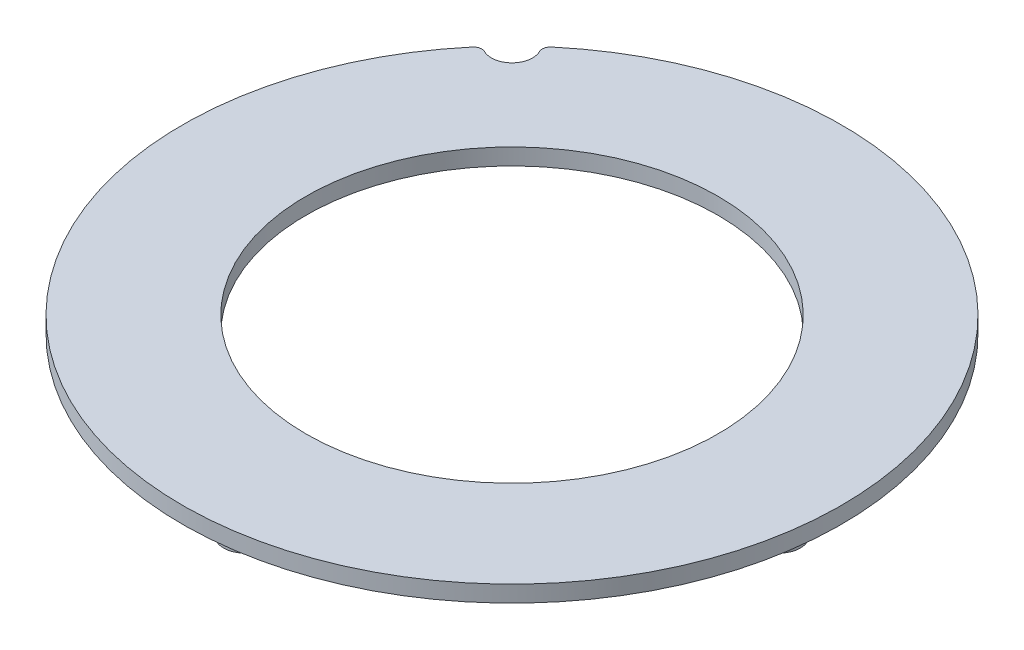
ISO-10303-21;
HEADER;
FILE_DESCRIPTION(('STEP AP214'),'2;1');
FILE_NAME('part.step','',(''),(''),'','','');
FILE_SCHEMA(('AUTOMOTIVE_DESIGN { 1 0 10303 214 1 1 1 1 }'));
ENDSEC;
DATA;
#1=APPLICATION_CONTEXT('core data for automotive mechanical design processes');
#2=APPLICATION_PROTOCOL_DEFINITION('international standard','automotive_design',2000,#1);
#3=PRODUCT_CONTEXT('',#1,'mechanical');
#4=PRODUCT('Part','Part','',(#3));
#5=PRODUCT_RELATED_PRODUCT_CATEGORY('part','',(#4));
#6=PRODUCT_DEFINITION_FORMATION('','',#4);
#7=PRODUCT_DEFINITION_CONTEXT('part definition',#1,'design');
#8=PRODUCT_DEFINITION('design','',#6,#7);
#9=PRODUCT_DEFINITION_SHAPE('','',#8);
#10=(LENGTH_UNIT() NAMED_UNIT(*) SI_UNIT(.MILLI.,.METRE.));
#11=(NAMED_UNIT(*) PLANE_ANGLE_UNIT() SI_UNIT($,.RADIAN.));
#12=(NAMED_UNIT(*) SI_UNIT($,.STERADIAN.) SOLID_ANGLE_UNIT());
#13=UNCERTAINTY_MEASURE_WITH_UNIT(LENGTH_MEASURE(1.E-05),#10,'distance_accuracy_value','');
#14=(GEOMETRIC_REPRESENTATION_CONTEXT(3) GLOBAL_UNCERTAINTY_ASSIGNED_CONTEXT((#13)) GLOBAL_UNIT_ASSIGNED_CONTEXT((#10,
#11,#12)) REPRESENTATION_CONTEXT('',''));
#15=CARTESIAN_POINT('',(0.,0.,0.));
#16=DIRECTION('',(0.,0.,1.));
#17=DIRECTION('',(1.,0.,0.));
#18=AXIS2_PLACEMENT_3D('',#15,#16,#17);
#19=CARTESIAN_POINT('',(-29.8174898076826,-8.,-25.1379653426594));
#20=DIRECTION('',(0.,1.,0.));
#21=DIRECTION('',(0.,0.,1.));
#22=AXIS2_PLACEMENT_3D('',#19,#20,#21);
#23=CYLINDRICAL_SURFACE('',#22,1.);
#24=DIRECTION('',(0.,-1.,0.));
#25=VECTOR('',#24,1.);
#26=CARTESIAN_POINT('',(-30.5820408283924,2.,-25.7825285565737));
#27=LINE('',#26,#25);
#28=CARTESIAN_POINT('',(-30.5820408283924,2.,-25.7825285565737));
#29=VERTEX_POINT('',#28);
#30=CARTESIAN_POINT('',(-30.5820408283924,0.,-25.7825285565737));
#31=VERTEX_POINT('',#30);
#32=EDGE_CURVE('E98',#29,#31,#27,.T.);
#33=ORIENTED_EDGE('',*,*,#32,.F.);
#34=CARTESIAN_POINT('',(-29.8174898076826,2.,-25.1379653426594));
#35=DIRECTION('',(0.,1.,0.));
#36=DIRECTION('',(0.,0.,1.));
#37=AXIS2_PLACEMENT_3D('',#34,#35,#36);
#38=CIRCLE('',#37,1.);
#39=CARTESIAN_POINT('',(-29.3794273619053,2.,-26.0369098868887));
#40=VERTEX_POINT('',#39);
#41=EDGE_CURVE('E51',#40,#29,#38,.T.);
#42=ORIENTED_EDGE('',*,*,#41,.F.);
#43=DIRECTION('',(0.,1.,0.));
#44=VECTOR('',#43,1.);
#45=CARTESIAN_POINT('',(-29.3794273619053,-8.,-26.0369098868887));
#46=LINE('',#45,#44);
#47=CARTESIAN_POINT('',(-29.3794273619053,0.,-26.0369098868887));
#48=VERTEX_POINT('',#47);
#49=EDGE_CURVE('E115',#48,#40,#46,.T.);
#50=ORIENTED_EDGE('',*,*,#49,.F.);
#51=CARTESIAN_POINT('',(-29.8174898076826,0.,-25.1379653426594));
#52=DIRECTION('',(0.,1.,0.));
#53=DIRECTION('',(0.,0.,1.));
#54=AXIS2_PLACEMENT_3D('',#51,#52,#53);
#55=CIRCLE('',#54,1.);
#56=EDGE_CURVE('E13',#31,#48,#55,.F.);
#57=ORIENTED_EDGE('',*,*,#56,.F.);
#58=EDGE_LOOP('',(#33,#42,#50,#57));
#59=FACE_BOUND('',#58,.T.);
#60=ADVANCED_FACE('F44',(#59),#23,.T.);
#61=CARTESIAN_POINT('',(-25.1379653426595,2.,-29.8174898076825));
#62=DIRECTION('',(0.,1.,0.));
#63=DIRECTION('',(0.,0.,1.));
#64=AXIS2_PLACEMENT_3D('',#61,#62,#63);
#65=CYLINDRICAL_SURFACE('',#64,1.);
#66=DIRECTION('',(0.,1.,0.));
#67=VECTOR('',#66,1.);
#68=CARTESIAN_POINT('',(-26.0369098868888,-8.,-29.3794273619052));
#69=LINE('',#68,#67);
#70=CARTESIAN_POINT('',(-26.0369098868888,2.,-29.3794273619052));
#71=VERTEX_POINT('',#70);
#72=CARTESIAN_POINT('',(-26.0369098868888,0.,-29.3794273619052));
#73=VERTEX_POINT('',#72);
#74=EDGE_CURVE('E95',#71,#73,#69,.F.);
#75=ORIENTED_EDGE('',*,*,#74,.F.);
#76=CARTESIAN_POINT('',(-25.1379653426595,2.,-29.8174898076825));
#77=DIRECTION('',(0.,1.,0.));
#78=DIRECTION('',(0.,0.,1.));
#79=AXIS2_PLACEMENT_3D('',#76,#77,#78);
#80=CIRCLE('',#79,1.);
#81=CARTESIAN_POINT('',(-25.7825285565738,2.,-30.5820408283923));
#82=VERTEX_POINT('',#81);
#83=EDGE_CURVE('E99',#82,#71,#80,.T.);
#84=ORIENTED_EDGE('',*,*,#83,.F.);
#85=DIRECTION('',(0.,-1.,0.));
#86=VECTOR('',#85,1.);
#87=CARTESIAN_POINT('',(-25.7825285565738,2.,-30.5820408283923));
#88=LINE('',#87,#86);
#89=CARTESIAN_POINT('',(-25.7825285565738,0.,-30.5820408283923));
#90=VERTEX_POINT('',#89);
#91=EDGE_CURVE('E97',#90,#82,#88,.F.);
#92=ORIENTED_EDGE('',*,*,#91,.F.);
#93=CARTESIAN_POINT('',(-25.1379653426595,0.,-29.8174898076825));
#94=DIRECTION('',(0.,1.,0.));
#95=DIRECTION('',(0.,0.,1.));
#96=AXIS2_PLACEMENT_3D('',#93,#94,#95);
#97=CIRCLE('',#96,1.);
#98=EDGE_CURVE('E84',#73,#90,#97,.F.);
#99=ORIENTED_EDGE('',*,*,#98,.F.);
#100=EDGE_LOOP('',(#75,#84,#92,#99));
#101=FACE_BOUND('',#100,.T.);
#102=ADVANCED_FACE('F93',(#101),#65,.T.);
#103=CARTESIAN_POINT('',(0.,2.,0.));
#104=DIRECTION('',(0.,1.,0.));
#105=DIRECTION('',(0.,0.,1.));
#106=AXIS2_PLACEMENT_3D('',#103,#104,#105);
#107=PLANE('',#106);
#108=CARTESIAN_POINT('',(-28.284271247462,2.,-28.2842712474618));
#109=DIRECTION('',(0.,1.,0.));
#110=DIRECTION('',(0.,0.,1.));
#111=AXIS2_PLACEMENT_3D('',#108,#109,#110);
#112=CIRCLE('',#111,2.5);
#113=EDGE_CURVE('E89',#40,#71,#112,.T.);
#114=ORIENTED_EDGE('',*,*,#113,.F.);
#115=ORIENTED_EDGE('',*,*,#41,.T.);
#116=CARTESIAN_POINT('',(0.,2.,0.));
#117=DIRECTION('',(0.,1.,0.));
#118=DIRECTION('',(0.,0.,1.));
#119=AXIS2_PLACEMENT_3D('',#116,#117,#118);
#120=CIRCLE('',#119,40.);
#121=EDGE_CURVE('E120',#29,#82,#120,.T.);
#122=ORIENTED_EDGE('',*,*,#121,.T.);
#123=ORIENTED_EDGE('',*,*,#83,.T.);
#124=EDGE_LOOP('',(#114,#115,#122,#123));
#125=FACE_BOUND('',#124,.T.);
#126=CARTESIAN_POINT('',(0.,2.,0.));
#127=DIRECTION('',(0.,1.,0.));
#128=DIRECTION('',(0.,0.,1.));
#129=AXIS2_PLACEMENT_3D('',#126,#127,#128);
#130=CIRCLE('',#129,25.);
#131=CARTESIAN_POINT('',(0.,2.,25.));
#132=VERTEX_POINT('',#131);
#133=EDGE_CURVE('E129',#132,#132,#130,.T.);
#134=ORIENTED_EDGE('',*,*,#133,.F.);
#135=EDGE_LOOP('',(#134));
#136=FACE_BOUND('',#135,.T.);
#137=ADVANCED_FACE('F117',(#125,#136),#107,.T.);
#138=CARTESIAN_POINT('',(0.,0.,0.));
#139=DIRECTION('',(0.,1.,0.));
#140=DIRECTION('',(0.,0.,1.));
#141=AXIS2_PLACEMENT_3D('',#138,#139,#140);
#142=PLANE('',#141);
#143=CARTESIAN_POINT('',(-32.5,0.,1.23057102803823E-11));
#144=DIRECTION('',(0.,1.,0.));
#145=DIRECTION('',(0.,0.,1.));
#146=AXIS2_PLACEMENT_3D('',#143,#144,#145);
#147=CIRCLE('',#146,2.5);
#148=CARTESIAN_POINT('',(-32.5,0.,2.5000000000123));
#149=VERTEX_POINT('',#148);
#150=EDGE_CURVE('E104',#149,#149,#147,.F.);
#151=ORIENTED_EDGE('',*,*,#150,.F.);
#152=EDGE_LOOP('',(#151));
#153=FACE_BOUND('',#152,.T.);
#154=CARTESIAN_POINT('',(0.,0.,32.5));
#155=DIRECTION('',(0.,1.,0.));
#156=DIRECTION('',(0.,0.,1.));
#157=AXIS2_PLACEMENT_3D('',#154,#155,#156);
#158=CIRCLE('',#157,2.5);
#159=CARTESIAN_POINT('',(0.,0.,35.));
#160=VERTEX_POINT('',#159);
#161=EDGE_CURVE('E108',#160,#160,#158,.F.);
#162=ORIENTED_EDGE('',*,*,#161,.F.);
#163=EDGE_LOOP('',(#162));
#164=FACE_BOUND('',#163,.T.);
#165=CARTESIAN_POINT('',(32.5,0.,0.));
#166=DIRECTION('',(0.,1.,0.));
#167=DIRECTION('',(0.,0.,1.));
#168=AXIS2_PLACEMENT_3D('',#165,#166,#167);
#169=CIRCLE('',#168,2.5);
#170=CARTESIAN_POINT('',(32.5,0.,2.5));
#171=VERTEX_POINT('',#170);
#172=EDGE_CURVE('E127',#171,#171,#169,.F.);
#173=ORIENTED_EDGE('',*,*,#172,.F.);
#174=EDGE_LOOP('',(#173));
#175=FACE_BOUND('',#174,.T.);
#176=CARTESIAN_POINT('',(0.,0.,-32.5));
#177=DIRECTION('',(0.,1.,0.));
#178=DIRECTION('',(0.,0.,1.));
#179=AXIS2_PLACEMENT_3D('',#176,#177,#178);
#180=CIRCLE('',#179,2.5);
#181=CARTESIAN_POINT('',(0.,0.,-30.));
#182=VERTEX_POINT('',#181);
#183=EDGE_CURVE('E123',#182,#182,#180,.F.);
#184=ORIENTED_EDGE('',*,*,#183,.F.);
#185=EDGE_LOOP('',(#184));
#186=FACE_BOUND('',#185,.T.);
#187=CARTESIAN_POINT('',(0.,0.,0.));
#188=DIRECTION('',(0.,1.,0.));
#189=DIRECTION('',(0.,0.,1.));
#190=AXIS2_PLACEMENT_3D('',#187,#188,#189);
#191=CIRCLE('',#190,40.);
#192=EDGE_CURVE('E124',#31,#90,#191,.T.);
#193=ORIENTED_EDGE('',*,*,#192,.F.);
#194=ORIENTED_EDGE('',*,*,#56,.T.);
#195=CARTESIAN_POINT('',(-28.284271247462,0.,-28.2842712474618));
#196=DIRECTION('',(0.,1.,0.));
#197=DIRECTION('',(0.,0.,1.));
#198=AXIS2_PLACEMENT_3D('',#195,#196,#197);
#199=CIRCLE('',#198,2.5);
#200=EDGE_CURVE('E80',#48,#73,#199,.T.);
#201=ORIENTED_EDGE('',*,*,#200,.T.);
#202=ORIENTED_EDGE('',*,*,#98,.T.);
#203=EDGE_LOOP('',(#193,#194,#201,#202));
#204=FACE_BOUND('',#203,.T.);
#205=CARTESIAN_POINT('',(0.,0.,0.));
#206=DIRECTION('',(0.,1.,0.));
#207=DIRECTION('',(0.,0.,1.));
#208=AXIS2_PLACEMENT_3D('',#205,#206,#207);
#209=CIRCLE('',#208,25.);
#210=CARTESIAN_POINT('',(0.,0.,25.));
#211=VERTEX_POINT('',#210);
#212=EDGE_CURVE('E132',#211,#211,#209,.T.);
#213=ORIENTED_EDGE('',*,*,#212,.T.);
#214=EDGE_LOOP('',(#213));
#215=FACE_BOUND('',#214,.T.);
#216=ADVANCED_FACE('F82',(#153,#164,#175,#186,#204,#215),#142,.F.);
#217=CARTESIAN_POINT('',(0.,2.,0.));
#218=DIRECTION('',(0.,-1.,0.));
#219=DIRECTION('',(0.,0.,-1.));
#220=AXIS2_PLACEMENT_3D('',#217,#218,#219);
#221=CYLINDRICAL_SURFACE('',#220,40.);
#222=ORIENTED_EDGE('',*,*,#121,.F.);
#223=ORIENTED_EDGE('',*,*,#32,.T.);
#224=ORIENTED_EDGE('',*,*,#192,.T.);
#225=ORIENTED_EDGE('',*,*,#91,.T.);
#226=EDGE_LOOP('',(#222,#223,#224,#225));
#227=FACE_BOUND('',#226,.T.);
#228=ADVANCED_FACE('F122',(#227),#221,.T.);
#229=CARTESIAN_POINT('',(0.,2.,0.));
#230=DIRECTION('',(0.,-1.,0.));
#231=DIRECTION('',(0.,0.,-1.));
#232=AXIS2_PLACEMENT_3D('',#229,#230,#231);
#233=CYLINDRICAL_SURFACE('',#232,25.);
#234=ORIENTED_EDGE('',*,*,#133,.T.);
#235=EDGE_LOOP('',(#234));
#236=FACE_BOUND('',#235,.T.);
#237=ORIENTED_EDGE('',*,*,#212,.F.);
#238=EDGE_LOOP('',(#237));
#239=FACE_BOUND('',#238,.T.);
#240=ADVANCED_FACE('F152',(#236,#239),#233,.F.);
#241=CARTESIAN_POINT('',(0.,-5.,-32.5));
#242=DIRECTION('',(0.,1.,0.));
#243=DIRECTION('',(0.,0.,1.));
#244=AXIS2_PLACEMENT_3D('',#241,#242,#243);
#245=CYLINDRICAL_SURFACE('',#244,2.5);
#246=CARTESIAN_POINT('',(0.,-5.,-32.5));
#247=DIRECTION('',(0.,-1.,0.));
#248=DIRECTION('',(0.,0.,-1.));
#249=AXIS2_PLACEMENT_3D('',#246,#247,#248);
#250=CIRCLE('',#249,2.5);
#251=CARTESIAN_POINT('',(0.,-5.,-35.));
#252=VERTEX_POINT('',#251);
#253=EDGE_CURVE('E294',#252,#252,#250,.T.);
#254=ORIENTED_EDGE('',*,*,#253,.F.);
#255=EDGE_LOOP('',(#254));
#256=FACE_BOUND('',#255,.T.);
#257=ORIENTED_EDGE('',*,*,#183,.T.);
#258=EDGE_LOOP('',(#257));
#259=FACE_BOUND('',#258,.T.);
#260=ADVANCED_FACE('F149',(#256,#259),#245,.T.);
#261=CARTESIAN_POINT('',(0.,-5.,-32.5));
#262=DIRECTION('',(0.,-1.,0.));
#263=DIRECTION('',(0.,0.,-1.));
#264=AXIS2_PLACEMENT_3D('',#261,#262,#263);
#265=PLANE('',#264);
#266=ORIENTED_EDGE('',*,*,#253,.T.);
#267=EDGE_LOOP('',(#266));
#268=FACE_BOUND('',#267,.T.);
#269=ADVANCED_FACE('F151',(#268),#265,.T.);
#270=CARTESIAN_POINT('',(32.5,-5.,0.));
#271=DIRECTION('',(0.,1.,0.));
#272=DIRECTION('',(0.,0.,1.));
#273=AXIS2_PLACEMENT_3D('',#270,#271,#272);
#274=CYLINDRICAL_SURFACE('',#273,2.5);
#275=CARTESIAN_POINT('',(32.5,-5.,0.));
#276=DIRECTION('',(0.,-1.,0.));
#277=DIRECTION('',(0.,0.,-1.));
#278=AXIS2_PLACEMENT_3D('',#275,#276,#277);
#279=CIRCLE('',#278,2.5);
#280=CARTESIAN_POINT('',(32.5,-5.,-2.5));
#281=VERTEX_POINT('',#280);
#282=EDGE_CURVE('E288',#281,#281,#279,.T.);
#283=ORIENTED_EDGE('',*,*,#282,.F.);
#284=EDGE_LOOP('',(#283));
#285=FACE_BOUND('',#284,.T.);
#286=ORIENTED_EDGE('',*,*,#172,.T.);
#287=EDGE_LOOP('',(#286));
#288=FACE_BOUND('',#287,.T.);
#289=ADVANCED_FACE('F159',(#285,#288),#274,.T.);
#290=CARTESIAN_POINT('',(32.5,-5.,0.));
#291=DIRECTION('',(0.,-1.,0.));
#292=DIRECTION('',(0.,0.,-1.));
#293=AXIS2_PLACEMENT_3D('',#290,#291,#292);
#294=PLANE('',#293);
#295=ORIENTED_EDGE('',*,*,#282,.T.);
#296=EDGE_LOOP('',(#295));
#297=FACE_BOUND('',#296,.T.);
#298=ADVANCED_FACE('F203',(#297),#294,.T.);
#299=CARTESIAN_POINT('',(0.,-5.,32.5));
#300=DIRECTION('',(0.,1.,0.));
#301=DIRECTION('',(0.,0.,1.));
#302=AXIS2_PLACEMENT_3D('',#299,#300,#301);
#303=CYLINDRICAL_SURFACE('',#302,2.5);
#304=CARTESIAN_POINT('',(0.,-5.,32.5));
#305=DIRECTION('',(0.,-1.,0.));
#306=DIRECTION('',(0.,0.,-1.));
#307=AXIS2_PLACEMENT_3D('',#304,#305,#306);
#308=CIRCLE('',#307,2.5);
#309=CARTESIAN_POINT('',(0.,-5.,30.));
#310=VERTEX_POINT('',#309);
#311=EDGE_CURVE('E285',#310,#310,#308,.T.);
#312=ORIENTED_EDGE('',*,*,#311,.F.);
#313=EDGE_LOOP('',(#312));
#314=FACE_BOUND('',#313,.T.);
#315=ORIENTED_EDGE('',*,*,#161,.T.);
#316=EDGE_LOOP('',(#315));
#317=FACE_BOUND('',#316,.T.);
#318=ADVANCED_FACE('F139',(#314,#317),#303,.T.);
#319=CARTESIAN_POINT('',(0.,-5.,32.5));
#320=DIRECTION('',(0.,-1.,0.));
#321=DIRECTION('',(0.,0.,-1.));
#322=AXIS2_PLACEMENT_3D('',#319,#320,#321);
#323=PLANE('',#322);
#324=ORIENTED_EDGE('',*,*,#311,.T.);
#325=EDGE_LOOP('',(#324));
#326=FACE_BOUND('',#325,.T.);
#327=ADVANCED_FACE('F222',(#326),#323,.T.);
#328=CARTESIAN_POINT('',(-32.5,-5.,1.23057102803823E-11));
#329=DIRECTION('',(0.,1.,0.));
#330=DIRECTION('',(0.,0.,1.));
#331=AXIS2_PLACEMENT_3D('',#328,#329,#330);
#332=CYLINDRICAL_SURFACE('',#331,2.5);
#333=CARTESIAN_POINT('',(-32.5,-5.,1.23057102803823E-11));
#334=DIRECTION('',(0.,-1.,0.));
#335=DIRECTION('',(0.,0.,-1.));
#336=AXIS2_PLACEMENT_3D('',#333,#334,#335);
#337=CIRCLE('',#336,2.5);
#338=CARTESIAN_POINT('',(-32.5,-5.,-2.49999999998769));
#339=VERTEX_POINT('',#338);
#340=EDGE_CURVE('E88',#339,#339,#337,.T.);
#341=ORIENTED_EDGE('',*,*,#340,.F.);
#342=EDGE_LOOP('',(#341));
#343=FACE_BOUND('',#342,.T.);
#344=ORIENTED_EDGE('',*,*,#150,.T.);
#345=EDGE_LOOP('',(#344));
#346=FACE_BOUND('',#345,.T.);
#347=ADVANCED_FACE('F232',(#343,#346),#332,.T.);
#348=CARTESIAN_POINT('',(-32.5,-5.,1.23057102803823E-11));
#349=DIRECTION('',(0.,-1.,0.));
#350=DIRECTION('',(0.,0.,-1.));
#351=AXIS2_PLACEMENT_3D('',#348,#349,#350);
#352=PLANE('',#351);
#353=ORIENTED_EDGE('',*,*,#340,.T.);
#354=EDGE_LOOP('',(#353));
#355=FACE_BOUND('',#354,.T.);
#356=ADVANCED_FACE('F242',(#355),#352,.T.);
#357=CARTESIAN_POINT('',(-28.284271247462,-8.,-28.2842712474618));
#358=DIRECTION('',(0.,1.,0.));
#359=DIRECTION('',(0.,0.,1.));
#360=AXIS2_PLACEMENT_3D('',#357,#358,#359);
#361=CYLINDRICAL_SURFACE('',#360,2.5);
#362=ORIENTED_EDGE('',*,*,#200,.F.);
#363=ORIENTED_EDGE('',*,*,#49,.T.);
#364=ORIENTED_EDGE('',*,*,#113,.T.);
#365=ORIENTED_EDGE('',*,*,#74,.T.);
#366=EDGE_LOOP('',(#362,#363,#364,#365));
#367=FACE_BOUND('',#366,.T.);
#368=ADVANCED_FACE('F101',(#367),#361,.F.);
#369=CLOSED_SHELL('',(#60,#102,#137,#216,#228,#240,#260,#269,#289,#298,#318,#327,#347,#356,#368));
#370=MANIFOLD_SOLID_BREP('B2',#369);
#371=ADVANCED_BREP_SHAPE_REPRESENTATION('',(#18,#370),#14);
#372=SHAPE_DEFINITION_REPRESENTATION(#9,#371);
ENDSEC;
END-ISO-10303-21;
